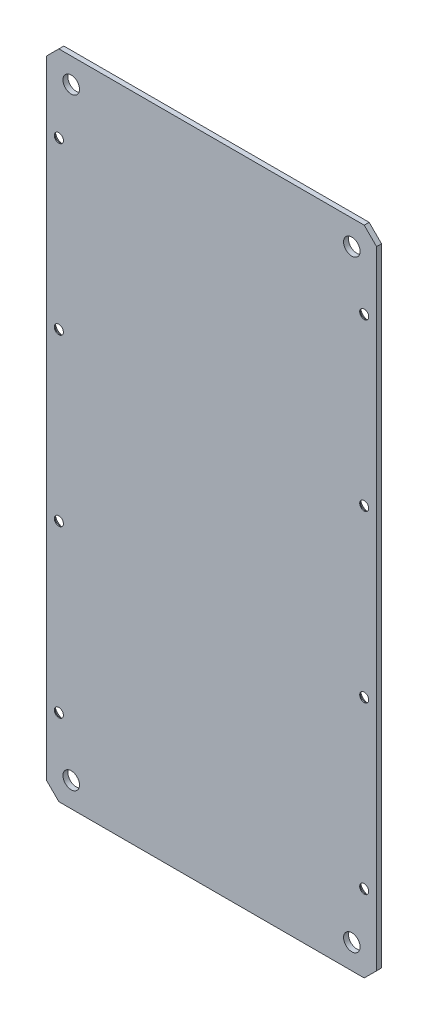
ISO-10303-21;
HEADER;
FILE_DESCRIPTION(('STEP AP214'),'2;1');
FILE_NAME('part.step','',(''),(''),'','','');
FILE_SCHEMA(('AUTOMOTIVE_DESIGN { 1 0 10303 214 1 1 1 1 }'));
ENDSEC;
DATA;
#1=APPLICATION_CONTEXT('core data for automotive mechanical design processes');
#2=APPLICATION_PROTOCOL_DEFINITION('international standard','automotive_design',2000,#1);
#3=PRODUCT_CONTEXT('',#1,'mechanical');
#4=PRODUCT('Part','Part','',(#3));
#5=PRODUCT_RELATED_PRODUCT_CATEGORY('part','',(#4));
#6=PRODUCT_DEFINITION_FORMATION('','',#4);
#7=PRODUCT_DEFINITION_CONTEXT('part definition',#1,'design');
#8=PRODUCT_DEFINITION('design','',#6,#7);
#9=PRODUCT_DEFINITION_SHAPE('','',#8);
#10=(LENGTH_UNIT() NAMED_UNIT(*) SI_UNIT(.MILLI.,.METRE.));
#11=(NAMED_UNIT(*) PLANE_ANGLE_UNIT() SI_UNIT($,.RADIAN.));
#12=(NAMED_UNIT(*) SI_UNIT($,.STERADIAN.) SOLID_ANGLE_UNIT());
#13=UNCERTAINTY_MEASURE_WITH_UNIT(LENGTH_MEASURE(1.E-05),#10,'distance_accuracy_value','');
#14=(GEOMETRIC_REPRESENTATION_CONTEXT(3) GLOBAL_UNCERTAINTY_ASSIGNED_CONTEXT((#13)) GLOBAL_UNIT_ASSIGNED_CONTEXT((#10,
#11,#12)) REPRESENTATION_CONTEXT('',''));
#15=CARTESIAN_POINT('',(0.,0.,0.));
#16=DIRECTION('',(0.,0.,1.));
#17=DIRECTION('',(1.,0.,0.));
#18=AXIS2_PLACEMENT_3D('',#15,#16,#17);
#19=CARTESIAN_POINT('',(-100.,197.5,3.));
#20=DIRECTION('',(0.,0.,-1.));
#21=DIRECTION('',(-1.,0.,0.));
#22=AXIS2_PLACEMENT_3D('',#19,#20,#21);
#23=PLANE('',#22);
#24=CARTESIAN_POINT('',(92.5,-50.25,3.));
#25=DIRECTION('',(0.,0.,1.));
#26=DIRECTION('',(1.,0.,0.));
#27=AXIS2_PLACEMENT_3D('',#24,#25,#26);
#28=CIRCLE('',#27,2.75000000000001);
#29=CARTESIAN_POINT('',(95.25,-50.25,3.));
#30=VERTEX_POINT('',#29);
#31=EDGE_CURVE('E353',#30,#30,#28,.T.);
#32=ORIENTED_EDGE('',*,*,#31,.F.);
#33=EDGE_LOOP('',(#32));
#34=FACE_BOUND('',#33,.T.);
#35=CARTESIAN_POINT('',(92.5000000000001,150.75,3.));
#36=DIRECTION('',(0.,0.,1.));
#37=DIRECTION('',(-1.,0.,0.));
#38=AXIS2_PLACEMENT_3D('',#35,#36,#37);
#39=CIRCLE('',#38,2.75000000000001);
#40=CARTESIAN_POINT('',(89.7500000000001,150.75,3.));
#41=VERTEX_POINT('',#40);
#42=EDGE_CURVE('E361',#41,#41,#39,.T.);
#43=ORIENTED_EDGE('',*,*,#42,.F.);
#44=EDGE_LOOP('',(#43));
#45=FACE_BOUND('',#44,.T.);
#46=CARTESIAN_POINT('',(-92.5,50.25,3.));
#47=DIRECTION('',(0.,0.,1.));
#48=DIRECTION('',(1.,0.,0.));
#49=AXIS2_PLACEMENT_3D('',#46,#47,#48);
#50=CIRCLE('',#49,2.75000000000001);
#51=CARTESIAN_POINT('',(-89.75,50.25,3.));
#52=VERTEX_POINT('',#51);
#53=EDGE_CURVE('E367',#52,#52,#50,.T.);
#54=ORIENTED_EDGE('',*,*,#53,.F.);
#55=EDGE_LOOP('',(#54));
#56=FACE_BOUND('',#55,.T.);
#57=CARTESIAN_POINT('',(-92.5,150.75,3.));
#58=DIRECTION('',(0.,0.,1.));
#59=DIRECTION('',(1.,0.,0.));
#60=AXIS2_PLACEMENT_3D('',#57,#58,#59);
#61=CIRCLE('',#60,2.75000000000001);
#62=CARTESIAN_POINT('',(-89.75,150.75,3.));
#63=VERTEX_POINT('',#62);
#64=EDGE_CURVE('E239',#63,#63,#61,.T.);
#65=ORIENTED_EDGE('',*,*,#64,.F.);
#66=EDGE_LOOP('',(#65));
#67=FACE_BOUND('',#66,.T.);
#68=CARTESIAN_POINT('',(84.9999999999998,-182.5,3.));
#69=DIRECTION('',(0.,0.,1.));
#70=DIRECTION('',(1.,0.,0.));
#71=AXIS2_PLACEMENT_3D('',#68,#69,#70);
#72=CIRCLE('',#71,5.00000000000002);
#73=CARTESIAN_POINT('',(89.9999999999998,-182.5,3.));
#74=VERTEX_POINT('',#73);
#75=EDGE_CURVE('E247',#74,#74,#72,.T.);
#76=ORIENTED_EDGE('',*,*,#75,.F.);
#77=EDGE_LOOP('',(#76));
#78=FACE_BOUND('',#77,.T.);
#79=CARTESIAN_POINT('',(-84.9999999999999,182.5,3.));
#80=DIRECTION('',(0.,0.,1.));
#81=DIRECTION('',(1.,0.,0.));
#82=AXIS2_PLACEMENT_3D('',#79,#80,#81);
#83=CIRCLE('',#82,5.00000000000002);
#84=CARTESIAN_POINT('',(-79.9999999999998,182.5,3.));
#85=VERTEX_POINT('',#84);
#86=EDGE_CURVE('E133',#85,#85,#83,.T.);
#87=ORIENTED_EDGE('',*,*,#86,.F.);
#88=EDGE_LOOP('',(#87));
#89=FACE_BOUND('',#88,.T.);
#90=DIRECTION('',(0.,-1.,0.));
#91=VECTOR('',#90,1.);
#92=CARTESIAN_POINT('',(-100.,-190.,3.));
#93=LINE('',#92,#91);
#94=CARTESIAN_POINT('',(-100.,190.,3.));
#95=VERTEX_POINT('',#94);
#96=CARTESIAN_POINT('',(-100.,-190.,3.));
#97=VERTEX_POINT('',#96);
#98=EDGE_CURVE('E144',#95,#97,#93,.T.);
#99=ORIENTED_EDGE('',*,*,#98,.T.);
#100=DIRECTION('',(0.707106781186548,-0.707106781186548,0.));
#101=VECTOR('',#100,1.);
#102=CARTESIAN_POINT('',(-100.,-190.,3.));
#103=LINE('',#102,#101);
#104=CARTESIAN_POINT('',(-92.5,-197.5,3.));
#105=VERTEX_POINT('',#104);
#106=EDGE_CURVE('E92',#97,#105,#103,.T.);
#107=ORIENTED_EDGE('',*,*,#106,.T.);
#108=DIRECTION('',(1.,0.,0.));
#109=VECTOR('',#108,1.);
#110=CARTESIAN_POINT('',(-92.5,-197.5,3.));
#111=LINE('',#110,#109);
#112=CARTESIAN_POINT('',(92.5,-197.5,3.));
#113=VERTEX_POINT('',#112);
#114=EDGE_CURVE('E260',#105,#113,#111,.T.);
#115=ORIENTED_EDGE('',*,*,#114,.T.);
#116=DIRECTION('',(0.707106781186548,0.707106781186548,0.));
#117=VECTOR('',#116,1.);
#118=CARTESIAN_POINT('',(92.5,-197.5,3.));
#119=LINE('',#118,#117);
#120=CARTESIAN_POINT('',(100.,-190.,3.));
#121=VERTEX_POINT('',#120);
#122=EDGE_CURVE('E262',#113,#121,#119,.T.);
#123=ORIENTED_EDGE('',*,*,#122,.T.);
#124=DIRECTION('',(0.,1.,0.));
#125=VECTOR('',#124,1.);
#126=CARTESIAN_POINT('',(100.,-190.,3.));
#127=LINE('',#126,#125);
#128=CARTESIAN_POINT('',(100.,190.,3.));
#129=VERTEX_POINT('',#128);
#130=EDGE_CURVE('E111',#121,#129,#127,.T.);
#131=ORIENTED_EDGE('',*,*,#130,.T.);
#132=DIRECTION('',(-0.707106781186551,0.707106781186544,0.));
#133=VECTOR('',#132,1.);
#134=CARTESIAN_POINT('',(92.5,197.5,3.));
#135=LINE('',#134,#133);
#136=CARTESIAN_POINT('',(92.5,197.5,3.));
#137=VERTEX_POINT('',#136);
#138=EDGE_CURVE('E105',#129,#137,#135,.T.);
#139=ORIENTED_EDGE('',*,*,#138,.T.);
#140=DIRECTION('',(-1.,0.,0.));
#141=VECTOR('',#140,1.);
#142=CARTESIAN_POINT('',(-92.5,197.5,3.));
#143=LINE('',#142,#141);
#144=CARTESIAN_POINT('',(-92.5,197.5,3.));
#145=VERTEX_POINT('',#144);
#146=EDGE_CURVE('E109',#137,#145,#143,.T.);
#147=ORIENTED_EDGE('',*,*,#146,.T.);
#148=DIRECTION('',(-0.707106781186547,-0.707106781186547,0.));
#149=VECTOR('',#148,1.);
#150=CARTESIAN_POINT('',(-100.,190.,3.));
#151=LINE('',#150,#149);
#152=EDGE_CURVE('E48',#145,#95,#151,.T.);
#153=ORIENTED_EDGE('',*,*,#152,.T.);
#154=EDGE_LOOP('',(#99,#107,#115,#123,#131,#139,#147,#153));
#155=FACE_BOUND('',#154,.T.);
#156=CARTESIAN_POINT('',(84.9999999999998,182.5,3.));
#157=DIRECTION('',(0.,0.,1.));
#158=DIRECTION('',(-1.,0.,0.));
#159=AXIS2_PLACEMENT_3D('',#156,#157,#158);
#160=CIRCLE('',#159,5.00000000000002);
#161=CARTESIAN_POINT('',(79.9999999999998,182.5,3.));
#162=VERTEX_POINT('',#161);
#163=EDGE_CURVE('E251',#162,#162,#160,.T.);
#164=ORIENTED_EDGE('',*,*,#163,.F.);
#165=EDGE_LOOP('',(#164));
#166=FACE_BOUND('',#165,.T.);
#167=CARTESIAN_POINT('',(-84.9999999999998,-182.5,3.));
#168=DIRECTION('',(0.,0.,1.));
#169=DIRECTION('',(-1.,0.,0.));
#170=AXIS2_PLACEMENT_3D('',#167,#168,#169);
#171=CIRCLE('',#170,5.00000000000002);
#172=CARTESIAN_POINT('',(-89.9999999999998,-182.5,3.));
#173=VERTEX_POINT('',#172);
#174=EDGE_CURVE('E238',#173,#173,#171,.T.);
#175=ORIENTED_EDGE('',*,*,#174,.F.);
#176=EDGE_LOOP('',(#175));
#177=FACE_BOUND('',#176,.T.);
#178=CARTESIAN_POINT('',(-92.5,-150.75,3.));
#179=DIRECTION('',(0.,0.,1.));
#180=DIRECTION('',(-1.,0.,0.));
#181=AXIS2_PLACEMENT_3D('',#178,#179,#180);
#182=CIRCLE('',#181,2.75000000000001);
#183=CARTESIAN_POINT('',(-95.25,-150.75,3.));
#184=VERTEX_POINT('',#183);
#185=EDGE_CURVE('E244',#184,#184,#182,.T.);
#186=ORIENTED_EDGE('',*,*,#185,.F.);
#187=EDGE_LOOP('',(#186));
#188=FACE_BOUND('',#187,.T.);
#189=CARTESIAN_POINT('',(-92.5,-50.25,3.));
#190=DIRECTION('',(0.,0.,1.));
#191=DIRECTION('',(-1.,0.,0.));
#192=AXIS2_PLACEMENT_3D('',#189,#190,#191);
#193=CIRCLE('',#192,2.75000000000001);
#194=CARTESIAN_POINT('',(-95.25,-50.25,3.));
#195=VERTEX_POINT('',#194);
#196=EDGE_CURVE('E364',#195,#195,#193,.T.);
#197=ORIENTED_EDGE('',*,*,#196,.F.);
#198=EDGE_LOOP('',(#197));
#199=FACE_BOUND('',#198,.T.);
#200=CARTESIAN_POINT('',(92.5,50.25,3.));
#201=DIRECTION('',(0.,0.,1.));
#202=DIRECTION('',(-1.,0.,0.));
#203=AXIS2_PLACEMENT_3D('',#200,#201,#202);
#204=CIRCLE('',#203,2.75000000000001);
#205=CARTESIAN_POINT('',(89.75,50.25,3.));
#206=VERTEX_POINT('',#205);
#207=EDGE_CURVE('E356',#206,#206,#204,.T.);
#208=ORIENTED_EDGE('',*,*,#207,.F.);
#209=EDGE_LOOP('',(#208));
#210=FACE_BOUND('',#209,.T.);
#211=CARTESIAN_POINT('',(92.5000000000001,-150.75,3.));
#212=DIRECTION('',(0.,0.,1.));
#213=DIRECTION('',(1.,0.,0.));
#214=AXIS2_PLACEMENT_3D('',#211,#212,#213);
#215=CIRCLE('',#214,2.75000000000001);
#216=CARTESIAN_POINT('',(95.2500000000001,-150.75,3.));
#217=VERTEX_POINT('',#216);
#218=EDGE_CURVE('E351',#217,#217,#215,.T.);
#219=ORIENTED_EDGE('',*,*,#218,.F.);
#220=EDGE_LOOP('',(#219));
#221=FACE_BOUND('',#220,.T.);
#222=ADVANCED_FACE('F31',(#34,#45,#56,#67,#78,#89,#155,#166,#177,#188,#199,#210,#221),#23,.F.);
#223=CARTESIAN_POINT('',(-100.,197.5,0.));
#224=DIRECTION('',(0.,0.,-1.));
#225=DIRECTION('',(-1.,0.,0.));
#226=AXIS2_PLACEMENT_3D('',#223,#224,#225);
#227=PLANE('',#226);
#228=CARTESIAN_POINT('',(-92.5,150.75,0.));
#229=DIRECTION('',(0.,0.,-1.));
#230=DIRECTION('',(-1.,0.,0.));
#231=AXIS2_PLACEMENT_3D('',#228,#229,#230);
#232=CIRCLE('',#231,5.25000000000005);
#233=CARTESIAN_POINT('',(-97.7500000000001,150.75,0.));
#234=VERTEX_POINT('',#233);
#235=EDGE_CURVE('E180',#234,#234,#232,.F.);
#236=ORIENTED_EDGE('',*,*,#235,.T.);
#237=EDGE_LOOP('',(#236));
#238=FACE_BOUND('',#237,.T.);
#239=CARTESIAN_POINT('',(-92.5,50.25,0.));
#240=DIRECTION('',(0.,0.,-1.));
#241=DIRECTION('',(-1.,0.,0.));
#242=AXIS2_PLACEMENT_3D('',#239,#240,#241);
#243=CIRCLE('',#242,5.25000000000005);
#244=CARTESIAN_POINT('',(-97.7500000000001,50.25,0.));
#245=VERTEX_POINT('',#244);
#246=EDGE_CURVE('E177',#245,#245,#243,.F.);
#247=ORIENTED_EDGE('',*,*,#246,.T.);
#248=EDGE_LOOP('',(#247));
#249=FACE_BOUND('',#248,.T.);
#250=CARTESIAN_POINT('',(-92.5,-50.25,0.));
#251=DIRECTION('',(0.,0.,-1.));
#252=DIRECTION('',(-1.,0.,0.));
#253=AXIS2_PLACEMENT_3D('',#250,#251,#252);
#254=CIRCLE('',#253,5.24999999999994);
#255=CARTESIAN_POINT('',(-97.75,-50.25,0.));
#256=VERTEX_POINT('',#255);
#257=EDGE_CURVE('E174',#256,#256,#254,.F.);
#258=ORIENTED_EDGE('',*,*,#257,.T.);
#259=EDGE_LOOP('',(#258));
#260=FACE_BOUND('',#259,.T.);
#261=CARTESIAN_POINT('',(-92.5,-150.75,0.));
#262=DIRECTION('',(0.,0.,-1.));
#263=DIRECTION('',(-1.,0.,0.));
#264=AXIS2_PLACEMENT_3D('',#261,#262,#263);
#265=CIRCLE('',#264,5.24999999999994);
#266=CARTESIAN_POINT('',(-97.75,-150.75,0.));
#267=VERTEX_POINT('',#266);
#268=EDGE_CURVE('E171',#267,#267,#265,.F.);
#269=ORIENTED_EDGE('',*,*,#268,.T.);
#270=EDGE_LOOP('',(#269));
#271=FACE_BOUND('',#270,.T.);
#272=CARTESIAN_POINT('',(92.5000000000001,-150.75,0.));
#273=DIRECTION('',(0.,0.,-1.));
#274=DIRECTION('',(-1.,0.,0.));
#275=AXIS2_PLACEMENT_3D('',#272,#273,#274);
#276=CIRCLE('',#275,5.25000000000005);
#277=CARTESIAN_POINT('',(87.2500000000001,-150.75,0.));
#278=VERTEX_POINT('',#277);
#279=EDGE_CURVE('E168',#278,#278,#276,.F.);
#280=ORIENTED_EDGE('',*,*,#279,.T.);
#281=EDGE_LOOP('',(#280));
#282=FACE_BOUND('',#281,.T.);
#283=CARTESIAN_POINT('',(92.5,-50.25,0.));
#284=DIRECTION('',(0.,0.,-1.));
#285=DIRECTION('',(-1.,0.,0.));
#286=AXIS2_PLACEMENT_3D('',#283,#284,#285);
#287=CIRCLE('',#286,5.24999999999994);
#288=CARTESIAN_POINT('',(87.2500000000001,-50.25,0.));
#289=VERTEX_POINT('',#288);
#290=EDGE_CURVE('E165',#289,#289,#287,.F.);
#291=ORIENTED_EDGE('',*,*,#290,.T.);
#292=EDGE_LOOP('',(#291));
#293=FACE_BOUND('',#292,.T.);
#294=CARTESIAN_POINT('',(92.5,50.25,0.));
#295=DIRECTION('',(0.,0.,-1.));
#296=DIRECTION('',(-1.,0.,0.));
#297=AXIS2_PLACEMENT_3D('',#294,#295,#296);
#298=CIRCLE('',#297,5.25000000000005);
#299=CARTESIAN_POINT('',(87.25,50.25,0.));
#300=VERTEX_POINT('',#299);
#301=EDGE_CURVE('E162',#300,#300,#298,.F.);
#302=ORIENTED_EDGE('',*,*,#301,.T.);
#303=EDGE_LOOP('',(#302));
#304=FACE_BOUND('',#303,.T.);
#305=CARTESIAN_POINT('',(92.5000000000001,150.75,0.));
#306=DIRECTION('',(0.,0.,-1.));
#307=DIRECTION('',(-1.,0.,0.));
#308=AXIS2_PLACEMENT_3D('',#305,#306,#307);
#309=CIRCLE('',#308,5.25000000000005);
#310=CARTESIAN_POINT('',(87.2500000000001,150.75,0.));
#311=VERTEX_POINT('',#310);
#312=EDGE_CURVE('E159',#311,#311,#309,.F.);
#313=ORIENTED_EDGE('',*,*,#312,.T.);
#314=EDGE_LOOP('',(#313));
#315=FACE_BOUND('',#314,.T.);
#316=CARTESIAN_POINT('',(84.9999999999998,-182.5,0.));
#317=DIRECTION('',(0.,0.,1.));
#318=DIRECTION('',(1.,0.,0.));
#319=AXIS2_PLACEMENT_3D('',#316,#317,#318);
#320=CIRCLE('',#319,5.00000000000002);
#321=CARTESIAN_POINT('',(89.9999999999998,-182.5,0.));
#322=VERTEX_POINT('',#321);
#323=EDGE_CURVE('E223',#322,#322,#320,.T.);
#324=ORIENTED_EDGE('',*,*,#323,.T.);
#325=EDGE_LOOP('',(#324));
#326=FACE_BOUND('',#325,.T.);
#327=CARTESIAN_POINT('',(-84.9999999999999,182.5,0.));
#328=DIRECTION('',(0.,0.,1.));
#329=DIRECTION('',(1.,0.,0.));
#330=AXIS2_PLACEMENT_3D('',#327,#328,#329);
#331=CIRCLE('',#330,5.00000000000002);
#332=CARTESIAN_POINT('',(-79.9999999999998,182.5,0.));
#333=VERTEX_POINT('',#332);
#334=EDGE_CURVE('E227',#333,#333,#331,.T.);
#335=ORIENTED_EDGE('',*,*,#334,.T.);
#336=EDGE_LOOP('',(#335));
#337=FACE_BOUND('',#336,.T.);
#338=DIRECTION('',(0.,-1.,0.));
#339=VECTOR('',#338,1.);
#340=CARTESIAN_POINT('',(-100.,-190.,0.));
#341=LINE('',#340,#339);
#342=CARTESIAN_POINT('',(-100.,190.,0.));
#343=VERTEX_POINT('',#342);
#344=CARTESIAN_POINT('',(-100.,-190.,0.));
#345=VERTEX_POINT('',#344);
#346=EDGE_CURVE('E129',#343,#345,#341,.T.);
#347=ORIENTED_EDGE('',*,*,#346,.F.);
#348=DIRECTION('',(-0.707106781186547,-0.707106781186547,0.));
#349=VECTOR('',#348,1.);
#350=CARTESIAN_POINT('',(-100.,190.,0.));
#351=LINE('',#350,#349);
#352=CARTESIAN_POINT('',(-92.5,197.5,0.));
#353=VERTEX_POINT('',#352);
#354=EDGE_CURVE('E83',#353,#343,#351,.T.);
#355=ORIENTED_EDGE('',*,*,#354,.F.);
#356=DIRECTION('',(-1.,0.,0.));
#357=VECTOR('',#356,1.);
#358=CARTESIAN_POINT('',(-92.5,197.5,0.));
#359=LINE('',#358,#357);
#360=CARTESIAN_POINT('',(92.5,197.5,0.));
#361=VERTEX_POINT('',#360);
#362=EDGE_CURVE('E77',#361,#353,#359,.T.);
#363=ORIENTED_EDGE('',*,*,#362,.F.);
#364=DIRECTION('',(-0.707106781186551,0.707106781186544,0.));
#365=VECTOR('',#364,1.);
#366=CARTESIAN_POINT('',(92.5,197.5,0.));
#367=LINE('',#366,#365);
#368=CARTESIAN_POINT('',(100.,190.,0.));
#369=VERTEX_POINT('',#368);
#370=EDGE_CURVE('E119',#369,#361,#367,.T.);
#371=ORIENTED_EDGE('',*,*,#370,.F.);
#372=DIRECTION('',(0.,1.,0.));
#373=VECTOR('',#372,1.);
#374=CARTESIAN_POINT('',(100.,-190.,0.));
#375=LINE('',#374,#373);
#376=CARTESIAN_POINT('',(100.,-190.,0.));
#377=VERTEX_POINT('',#376);
#378=EDGE_CURVE('E139',#377,#369,#375,.T.);
#379=ORIENTED_EDGE('',*,*,#378,.F.);
#380=DIRECTION('',(0.707106781186548,0.707106781186548,0.));
#381=VECTOR('',#380,1.);
#382=CARTESIAN_POINT('',(92.5,-197.5,0.));
#383=LINE('',#382,#381);
#384=CARTESIAN_POINT('',(92.5,-197.5,0.));
#385=VERTEX_POINT('',#384);
#386=EDGE_CURVE('E137',#385,#377,#383,.T.);
#387=ORIENTED_EDGE('',*,*,#386,.F.);
#388=DIRECTION('',(1.,0.,0.));
#389=VECTOR('',#388,1.);
#390=CARTESIAN_POINT('',(-92.5,-197.5,0.));
#391=LINE('',#390,#389);
#392=CARTESIAN_POINT('',(-92.5,-197.5,0.));
#393=VERTEX_POINT('',#392);
#394=EDGE_CURVE('E135',#393,#385,#391,.T.);
#395=ORIENTED_EDGE('',*,*,#394,.F.);
#396=DIRECTION('',(0.707106781186548,-0.707106781186548,0.));
#397=VECTOR('',#396,1.);
#398=CARTESIAN_POINT('',(-100.,-190.,0.));
#399=LINE('',#398,#397);
#400=EDGE_CURVE('E132',#345,#393,#399,.T.);
#401=ORIENTED_EDGE('',*,*,#400,.F.);
#402=EDGE_LOOP('',(#347,#355,#363,#371,#379,#387,#395,#401));
#403=FACE_BOUND('',#402,.T.);
#404=CARTESIAN_POINT('',(84.9999999999998,182.5,0.));
#405=DIRECTION('',(0.,0.,1.));
#406=DIRECTION('',(-1.,0.,0.));
#407=AXIS2_PLACEMENT_3D('',#404,#405,#406);
#408=CIRCLE('',#407,5.00000000000002);
#409=CARTESIAN_POINT('',(79.9999999999998,182.5,0.));
#410=VERTEX_POINT('',#409);
#411=EDGE_CURVE('E233',#410,#410,#408,.T.);
#412=ORIENTED_EDGE('',*,*,#411,.T.);
#413=EDGE_LOOP('',(#412));
#414=FACE_BOUND('',#413,.T.);
#415=CARTESIAN_POINT('',(-84.9999999999998,-182.5,0.));
#416=DIRECTION('',(0.,0.,1.));
#417=DIRECTION('',(-1.,0.,0.));
#418=AXIS2_PLACEMENT_3D('',#415,#416,#417);
#419=CIRCLE('',#418,5.00000000000002);
#420=CARTESIAN_POINT('',(-89.9999999999998,-182.5,0.));
#421=VERTEX_POINT('',#420);
#422=EDGE_CURVE('E236',#421,#421,#419,.T.);
#423=ORIENTED_EDGE('',*,*,#422,.T.);
#424=EDGE_LOOP('',(#423));
#425=FACE_BOUND('',#424,.T.);
#426=ADVANCED_FACE('F212',(#238,#249,#260,#271,#282,#293,#304,#315,#326,#337,#403,#414,#425),
#227,.T.);
#427=CARTESIAN_POINT('',(-100.,-190.,3.));
#428=DIRECTION('',(1.,0.,0.));
#429=DIRECTION('',(0.,0.,-1.));
#430=AXIS2_PLACEMENT_3D('',#427,#428,#429);
#431=PLANE('',#430);
#432=ORIENTED_EDGE('',*,*,#346,.T.);
#433=DIRECTION('',(0.,0.,-1.));
#434=VECTOR('',#433,1.);
#435=CARTESIAN_POINT('',(-100.,-190.,3.));
#436=LINE('',#435,#434);
#437=EDGE_CURVE('E157',#97,#345,#436,.T.);
#438=ORIENTED_EDGE('',*,*,#437,.F.);
#439=ORIENTED_EDGE('',*,*,#98,.F.);
#440=DIRECTION('',(0.,0.,-1.));
#441=VECTOR('',#440,1.);
#442=CARTESIAN_POINT('',(-100.,190.,3.));
#443=LINE('',#442,#441);
#444=EDGE_CURVE('E125',#95,#343,#443,.T.);
#445=ORIENTED_EDGE('',*,*,#444,.T.);
#446=EDGE_LOOP('',(#432,#438,#439,#445));
#447=FACE_BOUND('',#446,.T.);
#448=ADVANCED_FACE('F215',(#447),#431,.F.);
#449=CARTESIAN_POINT('',(-100.,-190.,3.));
#450=DIRECTION('',(0.707106781186547,0.707106781186547,0.));
#451=DIRECTION('',(-0.707106781186548,0.707106781186548,0.));
#452=AXIS2_PLACEMENT_3D('',#449,#450,#451);
#453=PLANE('',#452);
#454=ORIENTED_EDGE('',*,*,#400,.T.);
#455=DIRECTION('',(0.,0.,-1.));
#456=VECTOR('',#455,1.);
#457=CARTESIAN_POINT('',(-92.5,-197.5,3.));
#458=LINE('',#457,#456);
#459=EDGE_CURVE('E154',#105,#393,#458,.T.);
#460=ORIENTED_EDGE('',*,*,#459,.F.);
#461=ORIENTED_EDGE('',*,*,#106,.F.);
#462=ORIENTED_EDGE('',*,*,#437,.T.);
#463=EDGE_LOOP('',(#454,#460,#461,#462));
#464=FACE_BOUND('',#463,.T.);
#465=ADVANCED_FACE('F276',(#464),#453,.F.);
#466=CARTESIAN_POINT('',(-92.5,-197.5,3.));
#467=DIRECTION('',(0.,1.,0.));
#468=DIRECTION('',(-1.,0.,0.));
#469=AXIS2_PLACEMENT_3D('',#466,#467,#468);
#470=PLANE('',#469);
#471=ORIENTED_EDGE('',*,*,#394,.T.);
#472=DIRECTION('',(0.,0.,-1.));
#473=VECTOR('',#472,1.);
#474=CARTESIAN_POINT('',(92.5,-197.5,3.));
#475=LINE('',#474,#473);
#476=EDGE_CURVE('E151',#113,#385,#475,.T.);
#477=ORIENTED_EDGE('',*,*,#476,.F.);
#478=ORIENTED_EDGE('',*,*,#114,.F.);
#479=ORIENTED_EDGE('',*,*,#459,.T.);
#480=EDGE_LOOP('',(#471,#477,#478,#479));
#481=FACE_BOUND('',#480,.T.);
#482=ADVANCED_FACE('F275',(#481),#470,.F.);
#483=CARTESIAN_POINT('',(92.5,-197.5,3.));
#484=DIRECTION('',(-0.707106781186547,0.707106781186547,0.));
#485=DIRECTION('',(-0.707106781186548,-0.707106781186548,0.));
#486=AXIS2_PLACEMENT_3D('',#483,#484,#485);
#487=PLANE('',#486);
#488=ORIENTED_EDGE('',*,*,#386,.T.);
#489=DIRECTION('',(0.,0.,-1.));
#490=VECTOR('',#489,1.);
#491=CARTESIAN_POINT('',(100.,-190.,3.));
#492=LINE('',#491,#490);
#493=EDGE_CURVE('E148',#121,#377,#492,.T.);
#494=ORIENTED_EDGE('',*,*,#493,.F.);
#495=ORIENTED_EDGE('',*,*,#122,.F.);
#496=ORIENTED_EDGE('',*,*,#476,.T.);
#497=EDGE_LOOP('',(#488,#494,#495,#496));
#498=FACE_BOUND('',#497,.T.);
#499=ADVANCED_FACE('F268',(#498),#487,.F.);
#500=CARTESIAN_POINT('',(100.,-190.,3.));
#501=DIRECTION('',(-1.,0.,0.));
#502=DIRECTION('',(0.,0.,1.));
#503=AXIS2_PLACEMENT_3D('',#500,#501,#502);
#504=PLANE('',#503);
#505=ORIENTED_EDGE('',*,*,#378,.T.);
#506=DIRECTION('',(0.,0.,-1.));
#507=VECTOR('',#506,1.);
#508=CARTESIAN_POINT('',(100.,190.,3.));
#509=LINE('',#508,#507);
#510=EDGE_CURVE('E120',#129,#369,#509,.T.);
#511=ORIENTED_EDGE('',*,*,#510,.F.);
#512=ORIENTED_EDGE('',*,*,#130,.F.);
#513=ORIENTED_EDGE('',*,*,#493,.T.);
#514=EDGE_LOOP('',(#505,#511,#512,#513));
#515=FACE_BOUND('',#514,.T.);
#516=ADVANCED_FACE('F272',(#515),#504,.F.);
#517=CARTESIAN_POINT('',(92.5,197.5,3.));
#518=DIRECTION('',(-0.707106781186544,-0.707106781186551,0.));
#519=DIRECTION('',(0.707106781186551,-0.707106781186544,0.));
#520=AXIS2_PLACEMENT_3D('',#517,#518,#519);
#521=PLANE('',#520);
#522=ORIENTED_EDGE('',*,*,#370,.T.);
#523=DIRECTION('',(0.,0.,-1.));
#524=VECTOR('',#523,1.);
#525=CARTESIAN_POINT('',(92.5,197.5,3.));
#526=LINE('',#525,#524);
#527=EDGE_CURVE('E116',#137,#361,#526,.T.);
#528=ORIENTED_EDGE('',*,*,#527,.F.);
#529=ORIENTED_EDGE('',*,*,#138,.F.);
#530=ORIENTED_EDGE('',*,*,#510,.T.);
#531=EDGE_LOOP('',(#522,#528,#529,#530));
#532=FACE_BOUND('',#531,.T.);
#533=ADVANCED_FACE('F117',(#532),#521,.F.);
#534=CARTESIAN_POINT('',(-92.5,197.5,3.));
#535=DIRECTION('',(0.,-1.,0.));
#536=DIRECTION('',(0.,0.,-1.));
#537=AXIS2_PLACEMENT_3D('',#534,#535,#536);
#538=PLANE('',#537);
#539=ORIENTED_EDGE('',*,*,#362,.T.);
#540=DIRECTION('',(0.,0.,-1.));
#541=VECTOR('',#540,1.);
#542=CARTESIAN_POINT('',(-92.5,197.5,3.));
#543=LINE('',#542,#541);
#544=EDGE_CURVE('E121',#145,#353,#543,.T.);
#545=ORIENTED_EDGE('',*,*,#544,.F.);
#546=ORIENTED_EDGE('',*,*,#146,.F.);
#547=ORIENTED_EDGE('',*,*,#527,.T.);
#548=EDGE_LOOP('',(#539,#545,#546,#547));
#549=FACE_BOUND('',#548,.T.);
#550=ADVANCED_FACE('F123',(#549),#538,.F.);
#551=CARTESIAN_POINT('',(-100.,190.,3.));
#552=DIRECTION('',(0.707106781186548,-0.707106781186548,0.));
#553=DIRECTION('',(0.707106781186548,0.707106781186548,0.));
#554=AXIS2_PLACEMENT_3D('',#551,#552,#553);
#555=PLANE('',#554);
#556=ORIENTED_EDGE('',*,*,#354,.T.);
#557=ORIENTED_EDGE('',*,*,#444,.F.);
#558=ORIENTED_EDGE('',*,*,#152,.F.);
#559=ORIENTED_EDGE('',*,*,#544,.T.);
#560=EDGE_LOOP('',(#556,#557,#558,#559));
#561=FACE_BOUND('',#560,.T.);
#562=ADVANCED_FACE('F280',(#561),#555,.F.);
#563=CARTESIAN_POINT('',(-84.9999999999999,182.5,3.));
#564=DIRECTION('',(0.,0.,-1.));
#565=DIRECTION('',(-1.,0.,0.));
#566=AXIS2_PLACEMENT_3D('',#563,#564,#565);
#567=CYLINDRICAL_SURFACE('',#566,5.00000000000002);
#568=ORIENTED_EDGE('',*,*,#86,.T.);
#569=EDGE_LOOP('',(#568));
#570=FACE_BOUND('',#569,.T.);
#571=ORIENTED_EDGE('',*,*,#334,.F.);
#572=EDGE_LOOP('',(#571));
#573=FACE_BOUND('',#572,.T.);
#574=ADVANCED_FACE('F282',(#570,#573),#567,.F.);
#575=CARTESIAN_POINT('',(84.9999999999998,182.5,3.));
#576=DIRECTION('',(0.,0.,-1.));
#577=DIRECTION('',(-1.,0.,0.));
#578=AXIS2_PLACEMENT_3D('',#575,#576,#577);
#579=CYLINDRICAL_SURFACE('',#578,5.00000000000002);
#580=ORIENTED_EDGE('',*,*,#163,.T.);
#581=EDGE_LOOP('',(#580));
#582=FACE_BOUND('',#581,.T.);
#583=ORIENTED_EDGE('',*,*,#411,.F.);
#584=EDGE_LOOP('',(#583));
#585=FACE_BOUND('',#584,.T.);
#586=ADVANCED_FACE('F288',(#582,#585),#579,.F.);
#587=CARTESIAN_POINT('',(84.9999999999998,-182.5,3.));
#588=DIRECTION('',(0.,0.,-1.));
#589=DIRECTION('',(-1.,0.,0.));
#590=AXIS2_PLACEMENT_3D('',#587,#588,#589);
#591=CYLINDRICAL_SURFACE('',#590,5.00000000000002);
#592=ORIENTED_EDGE('',*,*,#75,.T.);
#593=EDGE_LOOP('',(#592));
#594=FACE_BOUND('',#593,.T.);
#595=ORIENTED_EDGE('',*,*,#323,.F.);
#596=EDGE_LOOP('',(#595));
#597=FACE_BOUND('',#596,.T.);
#598=ADVANCED_FACE('F302',(#594,#597),#591,.F.);
#599=CARTESIAN_POINT('',(-84.9999999999998,-182.5,3.));
#600=DIRECTION('',(0.,0.,-1.));
#601=DIRECTION('',(-1.,0.,0.));
#602=AXIS2_PLACEMENT_3D('',#599,#600,#601);
#603=CYLINDRICAL_SURFACE('',#602,5.00000000000002);
#604=ORIENTED_EDGE('',*,*,#174,.T.);
#605=EDGE_LOOP('',(#604));
#606=FACE_BOUND('',#605,.T.);
#607=ORIENTED_EDGE('',*,*,#422,.F.);
#608=EDGE_LOOP('',(#607));
#609=FACE_BOUND('',#608,.T.);
#610=ADVANCED_FACE('F306',(#606,#609),#603,.F.);
#611=CARTESIAN_POINT('',(-92.5,150.75,3.));
#612=DIRECTION('',(0.,0.,-1.));
#613=DIRECTION('',(-1.,0.,0.));
#614=AXIS2_PLACEMENT_3D('',#611,#612,#613);
#615=CYLINDRICAL_SURFACE('',#614,2.75000000000001);
#616=CARTESIAN_POINT('',(-92.5,150.75,2.50000000000006));
#617=DIRECTION('',(0.,0.,-1.));
#618=DIRECTION('',(-1.,0.,0.));
#619=AXIS2_PLACEMENT_3D('',#616,#617,#618);
#620=CIRCLE('',#619,2.75000000000001);
#621=CARTESIAN_POINT('',(-95.25,150.75,2.50000000000006));
#622=VERTEX_POINT('',#621);
#623=EDGE_CURVE('E183',#622,#622,#620,.T.);
#624=ORIENTED_EDGE('',*,*,#623,.T.);
#625=EDGE_LOOP('',(#624));
#626=FACE_BOUND('',#625,.T.);
#627=ORIENTED_EDGE('',*,*,#64,.T.);
#628=EDGE_LOOP('',(#627));
#629=FACE_BOUND('',#628,.T.);
#630=ADVANCED_FACE('F310',(#626,#629),#615,.F.);
#631=CARTESIAN_POINT('',(-92.5,-150.75,3.));
#632=DIRECTION('',(0.,0.,-1.));
#633=DIRECTION('',(-1.,0.,0.));
#634=AXIS2_PLACEMENT_3D('',#631,#632,#633);
#635=CYLINDRICAL_SURFACE('',#634,2.75000000000001);
#636=CARTESIAN_POINT('',(-92.5,-150.75,2.49999999999995));
#637=DIRECTION('',(0.,0.,-1.));
#638=DIRECTION('',(-1.,0.,0.));
#639=AXIS2_PLACEMENT_3D('',#636,#637,#638);
#640=CIRCLE('',#639,2.75000000000001);
#641=CARTESIAN_POINT('',(-95.25,-150.75,2.49999999999995));
#642=VERTEX_POINT('',#641);
#643=EDGE_CURVE('E192',#642,#642,#640,.T.);
#644=ORIENTED_EDGE('',*,*,#643,.T.);
#645=EDGE_LOOP('',(#644));
#646=FACE_BOUND('',#645,.T.);
#647=ORIENTED_EDGE('',*,*,#185,.T.);
#648=EDGE_LOOP('',(#647));
#649=FACE_BOUND('',#648,.T.);
#650=ADVANCED_FACE('F314',(#646,#649),#635,.F.);
#651=CARTESIAN_POINT('',(-92.5,50.25,3.));
#652=DIRECTION('',(0.,0.,-1.));
#653=DIRECTION('',(-1.,0.,0.));
#654=AXIS2_PLACEMENT_3D('',#651,#652,#653);
#655=CYLINDRICAL_SURFACE('',#654,2.75000000000001);
#656=CARTESIAN_POINT('',(-92.5,50.25,2.50000000000006));
#657=DIRECTION('',(0.,0.,-1.));
#658=DIRECTION('',(-1.,0.,0.));
#659=AXIS2_PLACEMENT_3D('',#656,#657,#658);
#660=CIRCLE('',#659,2.75000000000001);
#661=CARTESIAN_POINT('',(-95.25,50.25,2.50000000000006));
#662=VERTEX_POINT('',#661);
#663=EDGE_CURVE('E186',#662,#662,#660,.T.);
#664=ORIENTED_EDGE('',*,*,#663,.T.);
#665=EDGE_LOOP('',(#664));
#666=FACE_BOUND('',#665,.T.);
#667=ORIENTED_EDGE('',*,*,#53,.T.);
#668=EDGE_LOOP('',(#667));
#669=FACE_BOUND('',#668,.T.);
#670=ADVANCED_FACE('F318',(#666,#669),#655,.F.);
#671=CARTESIAN_POINT('',(-92.5,-50.25,3.));
#672=DIRECTION('',(0.,0.,-1.));
#673=DIRECTION('',(-1.,0.,0.));
#674=AXIS2_PLACEMENT_3D('',#671,#672,#673);
#675=CYLINDRICAL_SURFACE('',#674,2.75000000000001);
#676=CARTESIAN_POINT('',(-92.5,-50.25,2.49999999999995));
#677=DIRECTION('',(0.,0.,-1.));
#678=DIRECTION('',(-1.,0.,0.));
#679=AXIS2_PLACEMENT_3D('',#676,#677,#678);
#680=CIRCLE('',#679,2.75000000000001);
#681=CARTESIAN_POINT('',(-95.25,-50.25,2.49999999999995));
#682=VERTEX_POINT('',#681);
#683=EDGE_CURVE('E189',#682,#682,#680,.T.);
#684=ORIENTED_EDGE('',*,*,#683,.T.);
#685=EDGE_LOOP('',(#684));
#686=FACE_BOUND('',#685,.T.);
#687=ORIENTED_EDGE('',*,*,#196,.T.);
#688=EDGE_LOOP('',(#687));
#689=FACE_BOUND('',#688,.T.);
#690=ADVANCED_FACE('F322',(#686,#689),#675,.F.);
#691=CARTESIAN_POINT('',(92.5000000000001,150.75,3.));
#692=DIRECTION('',(0.,0.,-1.));
#693=DIRECTION('',(-1.,0.,0.));
#694=AXIS2_PLACEMENT_3D('',#691,#692,#693);
#695=CYLINDRICAL_SURFACE('',#694,2.75000000000001);
#696=CARTESIAN_POINT('',(92.5000000000001,150.75,2.50000000000006));
#697=DIRECTION('',(0.,0.,-1.));
#698=DIRECTION('',(-1.,0.,0.));
#699=AXIS2_PLACEMENT_3D('',#696,#697,#698);
#700=CIRCLE('',#699,2.75000000000001);
#701=CARTESIAN_POINT('',(89.7500000000001,150.75,2.50000000000006));
#702=VERTEX_POINT('',#701);
#703=EDGE_CURVE('E11',#702,#702,#700,.T.);
#704=ORIENTED_EDGE('',*,*,#703,.T.);
#705=EDGE_LOOP('',(#704));
#706=FACE_BOUND('',#705,.T.);
#707=ORIENTED_EDGE('',*,*,#42,.T.);
#708=EDGE_LOOP('',(#707));
#709=FACE_BOUND('',#708,.T.);
#710=ADVANCED_FACE('F326',(#706,#709),#695,.F.);
#711=CARTESIAN_POINT('',(92.5,50.25,3.));
#712=DIRECTION('',(0.,0.,-1.));
#713=DIRECTION('',(-1.,0.,0.));
#714=AXIS2_PLACEMENT_3D('',#711,#712,#713);
#715=CYLINDRICAL_SURFACE('',#714,2.75000000000001);
#716=CARTESIAN_POINT('',(92.5,50.25,2.50000000000006));
#717=DIRECTION('',(0.,0.,-1.));
#718=DIRECTION('',(-1.,0.,0.));
#719=AXIS2_PLACEMENT_3D('',#716,#717,#718);
#720=CIRCLE('',#719,2.75000000000001);
#721=CARTESIAN_POINT('',(89.75,50.25,2.50000000000006));
#722=VERTEX_POINT('',#721);
#723=EDGE_CURVE('E40',#722,#722,#720,.T.);
#724=ORIENTED_EDGE('',*,*,#723,.T.);
#725=EDGE_LOOP('',(#724));
#726=FACE_BOUND('',#725,.T.);
#727=ORIENTED_EDGE('',*,*,#207,.T.);
#728=EDGE_LOOP('',(#727));
#729=FACE_BOUND('',#728,.T.);
#730=ADVANCED_FACE('F203',(#726,#729),#715,.F.);
#731=CARTESIAN_POINT('',(92.5,-50.25,3.));
#732=DIRECTION('',(0.,0.,-1.));
#733=DIRECTION('',(-1.,0.,0.));
#734=AXIS2_PLACEMENT_3D('',#731,#732,#733);
#735=CYLINDRICAL_SURFACE('',#734,2.75000000000001);
#736=CARTESIAN_POINT('',(92.5,-50.25,2.49999999999995));
#737=DIRECTION('',(0.,0.,-1.));
#738=DIRECTION('',(-1.,0.,0.));
#739=AXIS2_PLACEMENT_3D('',#736,#737,#738);
#740=CIRCLE('',#739,2.75000000000001);
#741=CARTESIAN_POINT('',(89.75,-50.25,2.49999999999995));
#742=VERTEX_POINT('',#741);
#743=EDGE_CURVE('E198',#742,#742,#740,.T.);
#744=ORIENTED_EDGE('',*,*,#743,.T.);
#745=EDGE_LOOP('',(#744));
#746=FACE_BOUND('',#745,.T.);
#747=ORIENTED_EDGE('',*,*,#31,.T.);
#748=EDGE_LOOP('',(#747));
#749=FACE_BOUND('',#748,.T.);
#750=ADVANCED_FACE('F333',(#746,#749),#735,.F.);
#751=CARTESIAN_POINT('',(92.5000000000001,-150.75,3.));
#752=DIRECTION('',(0.,0.,-1.));
#753=DIRECTION('',(-1.,0.,0.));
#754=AXIS2_PLACEMENT_3D('',#751,#752,#753);
#755=CYLINDRICAL_SURFACE('',#754,2.75000000000001);
#756=CARTESIAN_POINT('',(92.5000000000001,-150.75,2.50000000000006));
#757=DIRECTION('',(0.,0.,-1.));
#758=DIRECTION('',(-1.,0.,0.));
#759=AXIS2_PLACEMENT_3D('',#756,#757,#758);
#760=CIRCLE('',#759,2.75000000000001);
#761=CARTESIAN_POINT('',(89.7500000000001,-150.75,2.50000000000006));
#762=VERTEX_POINT('',#761);
#763=EDGE_CURVE('E195',#762,#762,#760,.T.);
#764=ORIENTED_EDGE('',*,*,#763,.T.);
#765=EDGE_LOOP('',(#764));
#766=FACE_BOUND('',#765,.T.);
#767=ORIENTED_EDGE('',*,*,#218,.T.);
#768=EDGE_LOOP('',(#767));
#769=FACE_BOUND('',#768,.T.);
#770=ADVANCED_FACE('F336',(#766,#769),#755,.F.);
#771=CARTESIAN_POINT('',(-92.5,150.75,0.));
#772=DIRECTION('',(0.,0.,-1.));
#773=DIRECTION('',(-1.,0.,0.));
#774=AXIS2_PLACEMENT_3D('',#771,#772,#773);
#775=CONICAL_SURFACE('',#774,5.25000000000005,0.785398163397444);
#776=ORIENTED_EDGE('',*,*,#623,.F.);
#777=EDGE_LOOP('',(#776));
#778=FACE_BOUND('',#777,.T.);
#779=ORIENTED_EDGE('',*,*,#235,.F.);
#780=EDGE_LOOP('',(#779));
#781=FACE_BOUND('',#780,.T.);
#782=ADVANCED_FACE('F339',(#778,#781),#775,.F.);
#783=CARTESIAN_POINT('',(-92.5,50.25,0.));
#784=DIRECTION('',(0.,0.,-1.));
#785=DIRECTION('',(-1.,0.,0.));
#786=AXIS2_PLACEMENT_3D('',#783,#784,#785);
#787=CONICAL_SURFACE('',#786,5.25000000000005,0.785398163397444);
#788=ORIENTED_EDGE('',*,*,#663,.F.);
#789=EDGE_LOOP('',(#788));
#790=FACE_BOUND('',#789,.T.);
#791=ORIENTED_EDGE('',*,*,#246,.F.);
#792=EDGE_LOOP('',(#791));
#793=FACE_BOUND('',#792,.T.);
#794=ADVANCED_FACE('F344',(#790,#793),#787,.F.);
#795=CARTESIAN_POINT('',(-92.5,-50.25,0.));
#796=DIRECTION('',(0.,0.,-1.));
#797=DIRECTION('',(-1.,0.,0.));
#798=AXIS2_PLACEMENT_3D('',#795,#796,#797);
#799=CONICAL_SURFACE('',#798,5.24999999999994,0.785398163397444);
#800=ORIENTED_EDGE('',*,*,#683,.F.);
#801=EDGE_LOOP('',(#800));
#802=FACE_BOUND('',#801,.T.);
#803=ORIENTED_EDGE('',*,*,#257,.F.);
#804=EDGE_LOOP('',(#803));
#805=FACE_BOUND('',#804,.T.);
#806=ADVANCED_FACE('F414',(#802,#805),#799,.F.);
#807=CARTESIAN_POINT('',(-92.5,-150.75,0.));
#808=DIRECTION('',(0.,0.,-1.));
#809=DIRECTION('',(-1.,0.,0.));
#810=AXIS2_PLACEMENT_3D('',#807,#808,#809);
#811=CONICAL_SURFACE('',#810,5.24999999999994,0.785398163397444);
#812=ORIENTED_EDGE('',*,*,#643,.F.);
#813=EDGE_LOOP('',(#812));
#814=FACE_BOUND('',#813,.T.);
#815=ORIENTED_EDGE('',*,*,#268,.F.);
#816=EDGE_LOOP('',(#815));
#817=FACE_BOUND('',#816,.T.);
#818=ADVANCED_FACE('F398',(#814,#817),#811,.F.);
#819=CARTESIAN_POINT('',(92.5000000000001,-150.75,0.));
#820=DIRECTION('',(0.,0.,-1.));
#821=DIRECTION('',(-1.,0.,0.));
#822=AXIS2_PLACEMENT_3D('',#819,#820,#821);
#823=CONICAL_SURFACE('',#822,5.25000000000005,0.785398163397444);
#824=ORIENTED_EDGE('',*,*,#763,.F.);
#825=EDGE_LOOP('',(#824));
#826=FACE_BOUND('',#825,.T.);
#827=ORIENTED_EDGE('',*,*,#279,.F.);
#828=EDGE_LOOP('',(#827));
#829=FACE_BOUND('',#828,.T.);
#830=ADVANCED_FACE('F395',(#826,#829),#823,.F.);
#831=CARTESIAN_POINT('',(92.5,-50.25,0.));
#832=DIRECTION('',(0.,0.,-1.));
#833=DIRECTION('',(-1.,0.,0.));
#834=AXIS2_PLACEMENT_3D('',#831,#832,#833);
#835=CONICAL_SURFACE('',#834,5.24999999999994,0.785398163397444);
#836=ORIENTED_EDGE('',*,*,#743,.F.);
#837=EDGE_LOOP('',(#836));
#838=FACE_BOUND('',#837,.T.);
#839=ORIENTED_EDGE('',*,*,#290,.F.);
#840=EDGE_LOOP('',(#839));
#841=FACE_BOUND('',#840,.T.);
#842=ADVANCED_FACE('F209',(#838,#841),#835,.F.);
#843=CARTESIAN_POINT('',(92.5,50.25,0.));
#844=DIRECTION('',(0.,0.,-1.));
#845=DIRECTION('',(-1.,0.,0.));
#846=AXIS2_PLACEMENT_3D('',#843,#844,#845);
#847=CONICAL_SURFACE('',#846,5.25000000000005,0.785398163397444);
#848=ORIENTED_EDGE('',*,*,#723,.F.);
#849=EDGE_LOOP('',(#848));
#850=FACE_BOUND('',#849,.T.);
#851=ORIENTED_EDGE('',*,*,#301,.F.);
#852=EDGE_LOOP('',(#851));
#853=FACE_BOUND('',#852,.T.);
#854=ADVANCED_FACE('F206',(#850,#853),#847,.F.);
#855=CARTESIAN_POINT('',(92.5000000000001,150.75,0.));
#856=DIRECTION('',(0.,0.,-1.));
#857=DIRECTION('',(-1.,0.,0.));
#858=AXIS2_PLACEMENT_3D('',#855,#856,#857);
#859=CONICAL_SURFACE('',#858,5.25000000000005,0.785398163397444);
#860=ORIENTED_EDGE('',*,*,#703,.F.);
#861=EDGE_LOOP('',(#860));
#862=FACE_BOUND('',#861,.T.);
#863=ORIENTED_EDGE('',*,*,#312,.F.);
#864=EDGE_LOOP('',(#863));
#865=FACE_BOUND('',#864,.T.);
#866=ADVANCED_FACE('F33',(#862,#865),#859,.F.);
#867=CLOSED_SHELL('',(#222,#426,#448,#465,#482,#499,#516,#533,#550,#562,#574,#586,#598,#610,
#630,#650,#670,#690,#710,#730,#750,#770,#782,#794,#806,#818,#830,#842,#854,#866));
#868=MANIFOLD_SOLID_BREP('B2',#867);
#869=ADVANCED_BREP_SHAPE_REPRESENTATION('',(#18,#868),#14);
#870=SHAPE_DEFINITION_REPRESENTATION(#9,#869);
ENDSEC;
END-ISO-10303-21;
